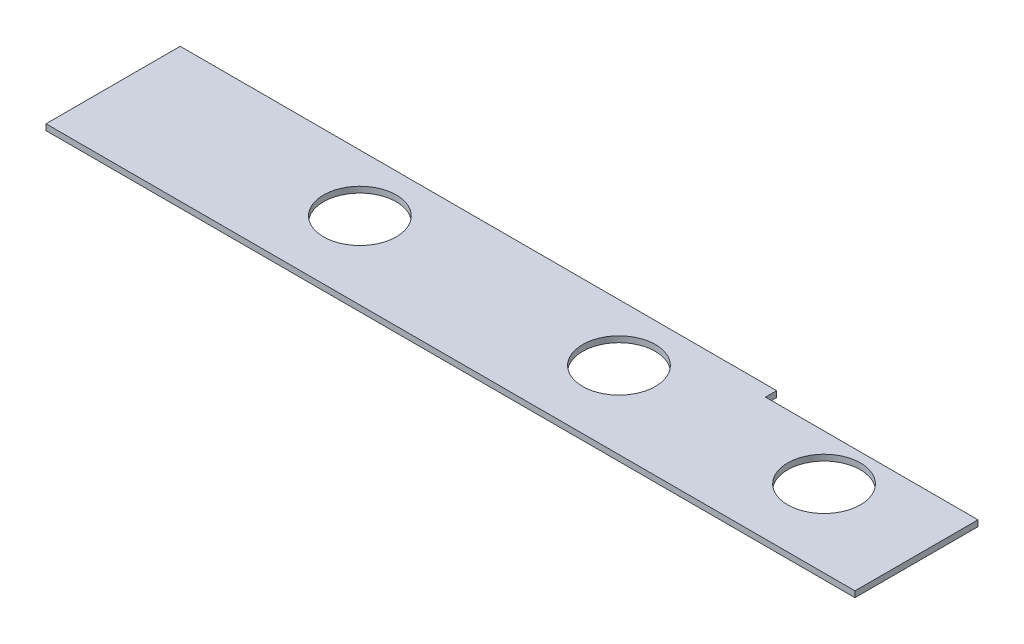
ISO-10303-21;
HEADER;
FILE_DESCRIPTION(('STEP AP214'),'2;1');
FILE_NAME('part.step','',(''),(''),'','','');
FILE_SCHEMA(('AUTOMOTIVE_DESIGN { 1 0 10303 214 1 1 1 1 }'));
ENDSEC;
DATA;
#1=APPLICATION_CONTEXT('core data for automotive mechanical design processes');
#2=APPLICATION_PROTOCOL_DEFINITION('international standard','automotive_design',2000,#1);
#3=PRODUCT_CONTEXT('',#1,'mechanical');
#4=PRODUCT('Part','Part','',(#3));
#5=PRODUCT_RELATED_PRODUCT_CATEGORY('part','',(#4));
#6=PRODUCT_DEFINITION_FORMATION('','',#4);
#7=PRODUCT_DEFINITION_CONTEXT('part definition',#1,'design');
#8=PRODUCT_DEFINITION('design','',#6,#7);
#9=PRODUCT_DEFINITION_SHAPE('','',#8);
#10=(LENGTH_UNIT() NAMED_UNIT(*) SI_UNIT(.MILLI.,.METRE.));
#11=(NAMED_UNIT(*) PLANE_ANGLE_UNIT() SI_UNIT($,.RADIAN.));
#12=(NAMED_UNIT(*) SI_UNIT($,.STERADIAN.) SOLID_ANGLE_UNIT());
#13=UNCERTAINTY_MEASURE_WITH_UNIT(LENGTH_MEASURE(1.E-05),#10,'distance_accuracy_value','');
#14=(GEOMETRIC_REPRESENTATION_CONTEXT(3) GLOBAL_UNCERTAINTY_ASSIGNED_CONTEXT((#13)) GLOBAL_UNIT_ASSIGNED_CONTEXT((#10,
#11,#12)) REPRESENTATION_CONTEXT('',''));
#15=CARTESIAN_POINT('',(0.,0.,0.));
#16=DIRECTION('',(0.,0.,1.));
#17=DIRECTION('',(1.,0.,0.));
#18=AXIS2_PLACEMENT_3D('',#15,#16,#17);
#19=CARTESIAN_POINT('',(0.,1.6,0.));
#20=DIRECTION('',(0.,1.,0.));
#21=DIRECTION('',(0.,0.,1.));
#22=AXIS2_PLACEMENT_3D('',#19,#20,#21);
#23=PLANE('',#22);
#24=CARTESIAN_POINT('',(24.5,1.6,-2.7));
#25=DIRECTION('',(0.,1.,0.));
#26=DIRECTION('',(0.,0.,1.));
#27=AXIS2_PLACEMENT_3D('',#24,#25,#26);
#28=CIRCLE('',#27,9.75);
#29=CARTESIAN_POINT('',(24.5,1.6,7.05));
#30=VERTEX_POINT('',#29);
#31=EDGE_CURVE('E211',#30,#30,#28,.T.);
#32=ORIENTED_EDGE('',*,*,#31,.F.);
#33=EDGE_LOOP('',(#32));
#34=FACE_BOUND('',#33,.T.);
#35=DIRECTION('',(0.,0.,1.));
#36=VECTOR('',#35,1.);
#37=CARTESIAN_POINT('',(-108.5,1.6,-18.));
#38=LINE('',#37,#36);
#39=CARTESIAN_POINT('',(-108.5,1.6,-18.));
#40=VERTEX_POINT('',#39);
#41=CARTESIAN_POINT('',(-108.5,1.6,18.));
#42=VERTEX_POINT('',#41);
#43=EDGE_CURVE('E150',#40,#42,#38,.T.);
#44=ORIENTED_EDGE('',*,*,#43,.T.);
#45=DIRECTION('',(1.,0.,0.));
#46=VECTOR('',#45,1.);
#47=CARTESIAN_POINT('',(-108.5,1.6,18.));
#48=LINE('',#47,#46);
#49=CARTESIAN_POINT('',(108.5,1.6,18.));
#50=VERTEX_POINT('',#49);
#51=EDGE_CURVE('E98',#42,#50,#48,.T.);
#52=ORIENTED_EDGE('',*,*,#51,.T.);
#53=DIRECTION('',(0.,0.,-1.));
#54=VECTOR('',#53,1.);
#55=CARTESIAN_POINT('',(108.5,1.6,-15.));
#56=LINE('',#55,#54);
#57=CARTESIAN_POINT('',(108.5,1.6,-15.));
#58=VERTEX_POINT('',#57);
#59=EDGE_CURVE('E111',#50,#58,#56,.T.);
#60=ORIENTED_EDGE('',*,*,#59,.T.);
#61=DIRECTION('',(-1.,0.,0.));
#62=VECTOR('',#61,1.);
#63=CARTESIAN_POINT('',(51.5,1.6,-15.));
#64=LINE('',#63,#62);
#65=CARTESIAN_POINT('',(51.5,1.6,-15.));
#66=VERTEX_POINT('',#65);
#67=EDGE_CURVE('E105',#58,#66,#64,.T.);
#68=ORIENTED_EDGE('',*,*,#67,.T.);
#69=DIRECTION('',(0.,0.,-1.));
#70=VECTOR('',#69,1.);
#71=CARTESIAN_POINT('',(51.5,1.6,-18.));
#72=LINE('',#71,#70);
#73=CARTESIAN_POINT('',(51.5,1.6,-18.));
#74=VERTEX_POINT('',#73);
#75=EDGE_CURVE('E109',#66,#74,#72,.T.);
#76=ORIENTED_EDGE('',*,*,#75,.T.);
#77=DIRECTION('',(-1.,0.,0.));
#78=VECTOR('',#77,1.);
#79=CARTESIAN_POINT('',(-108.5,1.6,-18.));
#80=LINE('',#79,#78);
#81=EDGE_CURVE('E61',#74,#40,#80,.T.);
#82=ORIENTED_EDGE('',*,*,#81,.T.);
#83=EDGE_LOOP('',(#44,#52,#60,#68,#76,#82));
#84=FACE_BOUND('',#83,.T.);
#85=CARTESIAN_POINT('',(-45.,1.6,-2.7));
#86=DIRECTION('',(0.,1.,0.));
#87=DIRECTION('',(0.,0.,1.));
#88=AXIS2_PLACEMENT_3D('',#85,#86,#87);
#89=CIRCLE('',#88,9.75);
#90=CARTESIAN_POINT('',(-45.,1.6,7.05));
#91=VERTEX_POINT('',#90);
#92=EDGE_CURVE('E138',#91,#91,#89,.T.);
#93=ORIENTED_EDGE('',*,*,#92,.F.);
#94=EDGE_LOOP('',(#93));
#95=FACE_BOUND('',#94,.T.);
#96=CARTESIAN_POINT('',(79.5,1.6,-2.7));
#97=DIRECTION('',(0.,1.,0.));
#98=DIRECTION('',(0.,0.,1.));
#99=AXIS2_PLACEMENT_3D('',#96,#97,#98);
#100=CIRCLE('',#99,9.74999999999999);
#101=CARTESIAN_POINT('',(79.5,1.6,7.05));
#102=VERTEX_POINT('',#101);
#103=EDGE_CURVE('E200',#102,#102,#100,.T.);
#104=ORIENTED_EDGE('',*,*,#103,.F.);
#105=EDGE_LOOP('',(#104));
#106=FACE_BOUND('',#105,.T.);
#107=ADVANCED_FACE('F43',(#34,#84,#95,#106),#23,.T.);
#108=CARTESIAN_POINT('',(0.,0.,0.));
#109=DIRECTION('',(0.,1.,0.));
#110=DIRECTION('',(0.,0.,1.));
#111=AXIS2_PLACEMENT_3D('',#108,#109,#110);
#112=PLANE('',#111);
#113=DIRECTION('',(0.,0.,1.));
#114=VECTOR('',#113,1.);
#115=CARTESIAN_POINT('',(-108.5,0.,-18.));
#116=LINE('',#115,#114);
#117=CARTESIAN_POINT('',(-108.5,0.,-18.));
#118=VERTEX_POINT('',#117);
#119=CARTESIAN_POINT('',(-108.5,0.,18.));
#120=VERTEX_POINT('',#119);
#121=EDGE_CURVE('E133',#118,#120,#116,.T.);
#122=ORIENTED_EDGE('',*,*,#121,.F.);
#123=DIRECTION('',(-1.,0.,0.));
#124=VECTOR('',#123,1.);
#125=CARTESIAN_POINT('',(-108.5,0.,-18.));
#126=LINE('',#125,#124);
#127=CARTESIAN_POINT('',(51.5,0.,-18.));
#128=VERTEX_POINT('',#127);
#129=EDGE_CURVE('E90',#128,#118,#126,.T.);
#130=ORIENTED_EDGE('',*,*,#129,.F.);
#131=DIRECTION('',(0.,0.,-1.));
#132=VECTOR('',#131,1.);
#133=CARTESIAN_POINT('',(51.5,0.,-18.));
#134=LINE('',#133,#132);
#135=CARTESIAN_POINT('',(51.5,0.,-15.));
#136=VERTEX_POINT('',#135);
#137=EDGE_CURVE('E84',#136,#128,#134,.T.);
#138=ORIENTED_EDGE('',*,*,#137,.F.);
#139=DIRECTION('',(-1.,0.,0.));
#140=VECTOR('',#139,1.);
#141=CARTESIAN_POINT('',(51.5,0.,-15.));
#142=LINE('',#141,#140);
#143=CARTESIAN_POINT('',(108.5,0.,-15.));
#144=VERTEX_POINT('',#143);
#145=EDGE_CURVE('E120',#144,#136,#142,.T.);
#146=ORIENTED_EDGE('',*,*,#145,.F.);
#147=DIRECTION('',(0.,0.,-1.));
#148=VECTOR('',#147,1.);
#149=CARTESIAN_POINT('',(108.5,0.,-15.));
#150=LINE('',#149,#148);
#151=CARTESIAN_POINT('',(108.5,0.,18.));
#152=VERTEX_POINT('',#151);
#153=EDGE_CURVE('E141',#152,#144,#150,.T.);
#154=ORIENTED_EDGE('',*,*,#153,.F.);
#155=DIRECTION('',(1.,0.,0.));
#156=VECTOR('',#155,1.);
#157=CARTESIAN_POINT('',(-108.5,0.,18.));
#158=LINE('',#157,#156);
#159=EDGE_CURVE('E137',#120,#152,#158,.T.);
#160=ORIENTED_EDGE('',*,*,#159,.F.);
#161=EDGE_LOOP('',(#122,#130,#138,#146,#154,#160));
#162=FACE_BOUND('',#161,.T.);
#163=CARTESIAN_POINT('',(-45.,0.,-2.7));
#164=DIRECTION('',(0.,1.,0.));
#165=DIRECTION('',(0.,0.,1.));
#166=AXIS2_PLACEMENT_3D('',#163,#164,#165);
#167=CIRCLE('',#166,9.75);
#168=CARTESIAN_POINT('',(-45.,0.,7.05));
#169=VERTEX_POINT('',#168);
#170=EDGE_CURVE('E215',#169,#169,#167,.T.);
#171=ORIENTED_EDGE('',*,*,#170,.T.);
#172=EDGE_LOOP('',(#171));
#173=FACE_BOUND('',#172,.T.);
#174=CARTESIAN_POINT('',(24.5,0.,-2.7));
#175=DIRECTION('',(0.,1.,0.));
#176=DIRECTION('',(0.,0.,1.));
#177=AXIS2_PLACEMENT_3D('',#174,#175,#176);
#178=CIRCLE('',#177,9.75);
#179=CARTESIAN_POINT('',(24.5,0.,7.05));
#180=VERTEX_POINT('',#179);
#181=EDGE_CURVE('E208',#180,#180,#178,.T.);
#182=ORIENTED_EDGE('',*,*,#181,.T.);
#183=EDGE_LOOP('',(#182));
#184=FACE_BOUND('',#183,.T.);
#185=CARTESIAN_POINT('',(79.5,0.,-2.7));
#186=DIRECTION('',(0.,1.,0.));
#187=DIRECTION('',(0.,0.,1.));
#188=AXIS2_PLACEMENT_3D('',#185,#186,#187);
#189=CIRCLE('',#188,9.74999999999999);
#190=CARTESIAN_POINT('',(79.5,0.,7.05));
#191=VERTEX_POINT('',#190);
#192=EDGE_CURVE('E203',#191,#191,#189,.T.);
#193=ORIENTED_EDGE('',*,*,#192,.T.);
#194=EDGE_LOOP('',(#193));
#195=FACE_BOUND('',#194,.T.);
#196=ADVANCED_FACE('F163',(#162,#173,#184,#195),#112,.F.);
#197=CARTESIAN_POINT('',(-108.5,1.6,-18.));
#198=DIRECTION('',(1.,0.,0.));
#199=DIRECTION('',(0.,0.,-1.));
#200=AXIS2_PLACEMENT_3D('',#197,#198,#199);
#201=PLANE('',#200);
#202=ORIENTED_EDGE('',*,*,#121,.T.);
#203=DIRECTION('',(0.,-1.,0.));
#204=VECTOR('',#203,1.);
#205=CARTESIAN_POINT('',(-108.5,1.6,18.));
#206=LINE('',#205,#204);
#207=EDGE_CURVE('E11',#42,#120,#206,.T.);
#208=ORIENTED_EDGE('',*,*,#207,.F.);
#209=ORIENTED_EDGE('',*,*,#43,.F.);
#210=DIRECTION('',(0.,-1.,0.));
#211=VECTOR('',#210,1.);
#212=CARTESIAN_POINT('',(-108.5,1.6,-18.));
#213=LINE('',#212,#211);
#214=EDGE_CURVE('E129',#40,#118,#213,.T.);
#215=ORIENTED_EDGE('',*,*,#214,.T.);
#216=EDGE_LOOP('',(#202,#208,#209,#215));
#217=FACE_BOUND('',#216,.T.);
#218=ADVANCED_FACE('F45',(#217),#201,.F.);
#219=CARTESIAN_POINT('',(-108.5,1.6,18.));
#220=DIRECTION('',(0.,0.,-1.));
#221=DIRECTION('',(-1.,0.,0.));
#222=AXIS2_PLACEMENT_3D('',#219,#220,#221);
#223=PLANE('',#222);
#224=ORIENTED_EDGE('',*,*,#159,.T.);
#225=DIRECTION('',(0.,-1.,0.));
#226=VECTOR('',#225,1.);
#227=CARTESIAN_POINT('',(108.5,1.6,18.));
#228=LINE('',#227,#226);
#229=EDGE_CURVE('E53',#50,#152,#228,.T.);
#230=ORIENTED_EDGE('',*,*,#229,.F.);
#231=ORIENTED_EDGE('',*,*,#51,.F.);
#232=ORIENTED_EDGE('',*,*,#207,.T.);
#233=EDGE_LOOP('',(#224,#230,#231,#232));
#234=FACE_BOUND('',#233,.T.);
#235=ADVANCED_FACE('F275',(#234),#223,.F.);
#236=CARTESIAN_POINT('',(108.5,1.6,-15.));
#237=DIRECTION('',(-1.,0.,0.));
#238=DIRECTION('',(0.,0.,1.));
#239=AXIS2_PLACEMENT_3D('',#236,#237,#238);
#240=PLANE('',#239);
#241=ORIENTED_EDGE('',*,*,#153,.T.);
#242=DIRECTION('',(0.,-1.,0.));
#243=VECTOR('',#242,1.);
#244=CARTESIAN_POINT('',(108.5,1.6,-15.));
#245=LINE('',#244,#243);
#246=EDGE_CURVE('E122',#58,#144,#245,.T.);
#247=ORIENTED_EDGE('',*,*,#246,.F.);
#248=ORIENTED_EDGE('',*,*,#59,.F.);
#249=ORIENTED_EDGE('',*,*,#229,.T.);
#250=EDGE_LOOP('',(#241,#247,#248,#249));
#251=FACE_BOUND('',#250,.T.);
#252=ADVANCED_FACE('F160',(#251),#240,.F.);
#253=CARTESIAN_POINT('',(51.5,1.6,-15.));
#254=DIRECTION('',(0.,0.,1.));
#255=DIRECTION('',(1.,0.,0.));
#256=AXIS2_PLACEMENT_3D('',#253,#254,#255);
#257=PLANE('',#256);
#258=ORIENTED_EDGE('',*,*,#145,.T.);
#259=DIRECTION('',(0.,-1.,0.));
#260=VECTOR('',#259,1.);
#261=CARTESIAN_POINT('',(51.5,1.6,-15.));
#262=LINE('',#261,#260);
#263=EDGE_CURVE('E117',#66,#136,#262,.T.);
#264=ORIENTED_EDGE('',*,*,#263,.F.);
#265=ORIENTED_EDGE('',*,*,#67,.F.);
#266=ORIENTED_EDGE('',*,*,#246,.T.);
#267=EDGE_LOOP('',(#258,#264,#265,#266));
#268=FACE_BOUND('',#267,.T.);
#269=ADVANCED_FACE('F118',(#268),#257,.F.);
#270=CARTESIAN_POINT('',(51.5,1.6,-18.));
#271=DIRECTION('',(-1.,0.,0.));
#272=DIRECTION('',(0.,0.,1.));
#273=AXIS2_PLACEMENT_3D('',#270,#271,#272);
#274=PLANE('',#273);
#275=ORIENTED_EDGE('',*,*,#137,.T.);
#276=DIRECTION('',(0.,-1.,0.));
#277=VECTOR('',#276,1.);
#278=CARTESIAN_POINT('',(51.5,1.6,-18.));
#279=LINE('',#278,#277);
#280=EDGE_CURVE('E123',#74,#128,#279,.T.);
#281=ORIENTED_EDGE('',*,*,#280,.F.);
#282=ORIENTED_EDGE('',*,*,#75,.F.);
#283=ORIENTED_EDGE('',*,*,#263,.T.);
#284=EDGE_LOOP('',(#275,#281,#282,#283));
#285=FACE_BOUND('',#284,.T.);
#286=ADVANCED_FACE('F125',(#285),#274,.F.);
#287=CARTESIAN_POINT('',(-108.5,1.6,-18.));
#288=DIRECTION('',(0.,0.,1.));
#289=DIRECTION('',(1.,0.,0.));
#290=AXIS2_PLACEMENT_3D('',#287,#288,#289);
#291=PLANE('',#290);
#292=ORIENTED_EDGE('',*,*,#129,.T.);
#293=ORIENTED_EDGE('',*,*,#214,.F.);
#294=ORIENTED_EDGE('',*,*,#81,.F.);
#295=ORIENTED_EDGE('',*,*,#280,.T.);
#296=EDGE_LOOP('',(#292,#293,#294,#295));
#297=FACE_BOUND('',#296,.T.);
#298=ADVANCED_FACE('F168',(#297),#291,.F.);
#299=CARTESIAN_POINT('',(-45.,1.6,-2.7));
#300=DIRECTION('',(0.,-1.,0.));
#301=DIRECTION('',(0.,0.,-1.));
#302=AXIS2_PLACEMENT_3D('',#299,#300,#301);
#303=CYLINDRICAL_SURFACE('',#302,9.75);
#304=ORIENTED_EDGE('',*,*,#92,.T.);
#305=EDGE_LOOP('',(#304));
#306=FACE_BOUND('',#305,.T.);
#307=ORIENTED_EDGE('',*,*,#170,.F.);
#308=EDGE_LOOP('',(#307));
#309=FACE_BOUND('',#308,.T.);
#310=ADVANCED_FACE('F170',(#306,#309),#303,.F.);
#311=CARTESIAN_POINT('',(24.5,1.6,-2.7));
#312=DIRECTION('',(0.,-1.,0.));
#313=DIRECTION('',(0.,0.,-1.));
#314=AXIS2_PLACEMENT_3D('',#311,#312,#313);
#315=CYLINDRICAL_SURFACE('',#314,9.75);
#316=ORIENTED_EDGE('',*,*,#31,.T.);
#317=EDGE_LOOP('',(#316));
#318=FACE_BOUND('',#317,.T.);
#319=ORIENTED_EDGE('',*,*,#181,.F.);
#320=EDGE_LOOP('',(#319));
#321=FACE_BOUND('',#320,.T.);
#322=ADVANCED_FACE('F176',(#318,#321),#315,.F.);
#323=CARTESIAN_POINT('',(79.5,1.6,-2.7));
#324=DIRECTION('',(0.,-1.,0.));
#325=DIRECTION('',(0.,0.,-1.));
#326=AXIS2_PLACEMENT_3D('',#323,#324,#325);
#327=CYLINDRICAL_SURFACE('',#326,9.74999999999999);
#328=ORIENTED_EDGE('',*,*,#103,.T.);
#329=EDGE_LOOP('',(#328));
#330=FACE_BOUND('',#329,.T.);
#331=ORIENTED_EDGE('',*,*,#192,.F.);
#332=EDGE_LOOP('',(#331));
#333=FACE_BOUND('',#332,.T.);
#334=ADVANCED_FACE('F191',(#330,#333),#327,.F.);
#335=CLOSED_SHELL('',(#107,#196,#218,#235,#252,#269,#286,#298,#310,#322,#334));
#336=MANIFOLD_SOLID_BREP('B2',#335);
#337=ADVANCED_BREP_SHAPE_REPRESENTATION('',(#18,#336),#14);
#338=SHAPE_DEFINITION_REPRESENTATION(#9,#337);
ENDSEC;
END-ISO-10303-21;
